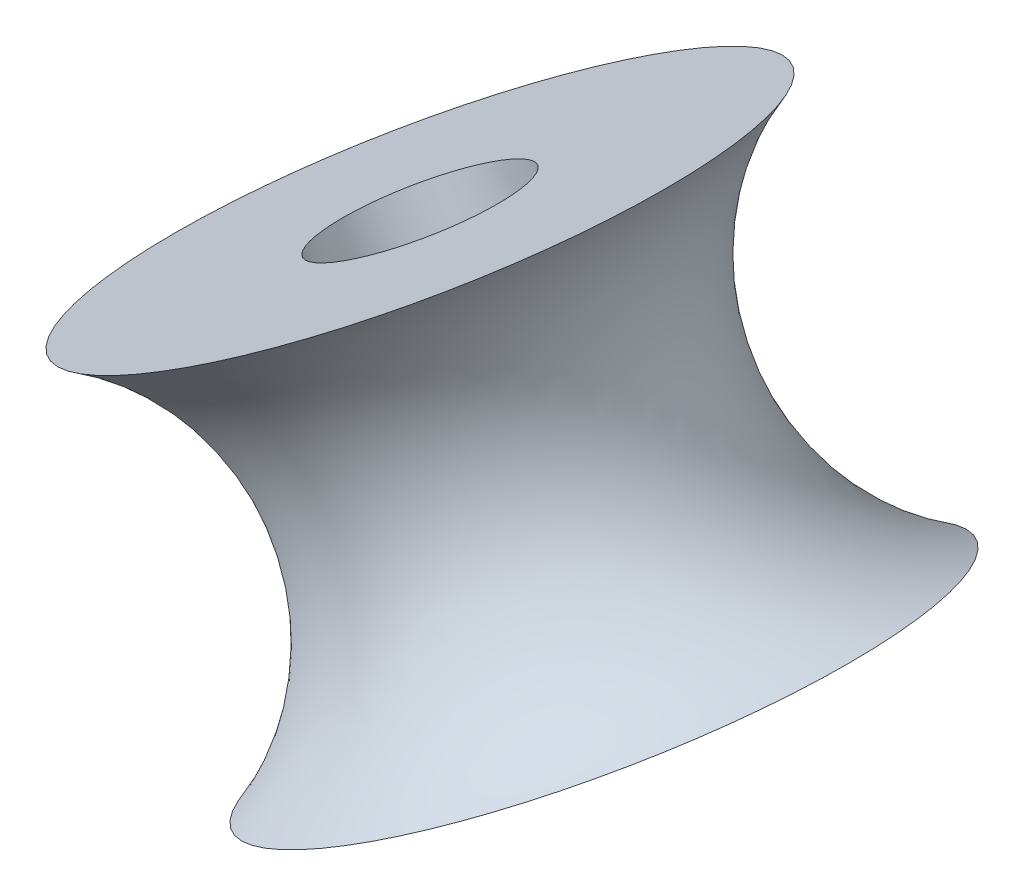
ISO-10303-21;
HEADER;
FILE_DESCRIPTION(('STEP AP214'),'2;1');
FILE_NAME('part.step','',(''),(''),'','','');
FILE_SCHEMA(('AUTOMOTIVE_DESIGN { 1 0 10303 214 1 1 1 1 }'));
ENDSEC;
DATA;
#1=APPLICATION_CONTEXT('core data for automotive mechanical design processes');
#2=APPLICATION_PROTOCOL_DEFINITION('international standard','automotive_design',2000,#1);
#3=PRODUCT_CONTEXT('',#1,'mechanical');
#4=PRODUCT('Part','Part','',(#3));
#5=PRODUCT_RELATED_PRODUCT_CATEGORY('part','',(#4));
#6=PRODUCT_DEFINITION_FORMATION('','',#4);
#7=PRODUCT_DEFINITION_CONTEXT('part definition',#1,'design');
#8=PRODUCT_DEFINITION('design','',#6,#7);
#9=PRODUCT_DEFINITION_SHAPE('','',#8);
#10=(LENGTH_UNIT() NAMED_UNIT(*) SI_UNIT(.MILLI.,.METRE.));
#11=(NAMED_UNIT(*) PLANE_ANGLE_UNIT() SI_UNIT($,.RADIAN.));
#12=(NAMED_UNIT(*) SI_UNIT($,.STERADIAN.) SOLID_ANGLE_UNIT());
#13=UNCERTAINTY_MEASURE_WITH_UNIT(LENGTH_MEASURE(1.E-05),#10,'distance_accuracy_value','');
#14=(GEOMETRIC_REPRESENTATION_CONTEXT(3) GLOBAL_UNCERTAINTY_ASSIGNED_CONTEXT((#13)) GLOBAL_UNIT_ASSIGNED_CONTEXT((#10,
#11,#12)) REPRESENTATION_CONTEXT('',''));
#15=CARTESIAN_POINT('',(0.,0.,0.));
#16=DIRECTION('',(0.,0.,1.));
#17=DIRECTION('',(1.,0.,0.));
#18=AXIS2_PLACEMENT_3D('',#15,#16,#17);
#19=CARTESIAN_POINT('',(-5.84601811404184E-13,5.82867087928207E-13,0.));
#20=DIRECTION('',(-0.5,0.866025403784439,0.));
#21=DIRECTION('',(-0.866025403784439,-0.5,0.));
#22=AXIS2_PLACEMENT_3D('',#19,#20,#21);
#23=TOROIDAL_SURFACE('',#22,11.6444415837057,6.35000000000081);
#24=CARTESIAN_POINT('',(-2.67500000000085,4.63323591024779,0.));
#25=DIRECTION('',(-0.5,0.866025403784439,0.));
#26=DIRECTION('',(-0.866025403784439,-0.5,0.));
#27=AXIS2_PLACEMENT_3D('',#24,#25,#26);
#28=CIRCLE('',#27,8.2239153084076);
#29=CARTESIAN_POINT('',(-9.79711957565357,0.521278256043992,0.));
#30=VERTEX_POINT('',#29);
#31=EDGE_CURVE('E10',#30,#30,#28,.T.);
#32=ORIENTED_EDGE('',*,*,#31,.F.);
#33=EDGE_LOOP('',(#32));
#34=FACE_BOUND('',#33,.T.);
#35=CARTESIAN_POINT('',(2.67499999999982,-4.63323591024687,0.));
#36=DIRECTION('',(-0.5,0.866025403784439,0.));
#37=DIRECTION('',(-0.866025403784439,-0.5,0.));
#38=AXIS2_PLACEMENT_3D('',#35,#36,#37);
#39=CIRCLE('',#38,8.22391530840803);
#40=CARTESIAN_POINT('',(-4.44711957565327,-8.74519356445088,0.));
#41=VERTEX_POINT('',#40);
#42=EDGE_CURVE('E53',#41,#41,#39,.T.);
#43=ORIENTED_EDGE('',*,*,#42,.T.);
#44=EDGE_LOOP('',(#43));
#45=FACE_BOUND('',#44,.T.);
#46=ADVANCED_FACE('F39',(#34,#45),#23,.F.);
#47=CARTESIAN_POINT('',(4.44711957565187,8.74519356445159,0.));
#48=DIRECTION('',(0.5,-0.866025403784439,0.));
#49=DIRECTION('',(0.866025403784439,0.5,0.));
#50=AXIS2_PLACEMENT_3D('',#47,#48,#49);
#51=PLANE('',#50);
#52=CARTESIAN_POINT('',(-2.67500000000085,4.63323591024779,0.));
#53=DIRECTION('',(-0.5,0.866025403784439,0.));
#54=DIRECTION('',(-0.866025403784439,-0.5,0.));
#55=AXIS2_PLACEMENT_3D('',#52,#53,#54);
#56=CIRCLE('',#55,2.60000000000024);
#57=CARTESIAN_POINT('',(-4.9266660498406,3.33323591024767,0.));
#58=VERTEX_POINT('',#57);
#59=EDGE_CURVE('E45',#58,#58,#56,.T.);
#60=ORIENTED_EDGE('',*,*,#59,.F.);
#61=EDGE_LOOP('',(#60));
#62=FACE_BOUND('',#61,.T.);
#63=ORIENTED_EDGE('',*,*,#31,.T.);
#64=EDGE_LOOP('',(#63));
#65=FACE_BOUND('',#64,.T.);
#66=ADVANCED_FACE('F68',(#62,#65),#51,.F.);
#67=CARTESIAN_POINT('',(-2.67500000000085,4.63323591024779,0.));
#68=DIRECTION('',(-0.5,0.866025403784439,0.));
#69=DIRECTION('',(-0.866025403784439,-0.5,0.));
#70=AXIS2_PLACEMENT_3D('',#67,#68,#69);
#71=CYLINDRICAL_SURFACE('',#70,2.60000000000024);
#72=CARTESIAN_POINT('',(2.67499999999982,-4.63323591024687,0.));
#73=DIRECTION('',(-0.5,0.866025403784439,0.));
#74=DIRECTION('',(-0.866025403784439,-0.5,0.));
#75=AXIS2_PLACEMENT_3D('',#72,#73,#74);
#76=CIRCLE('',#75,2.60000000000024);
#77=CARTESIAN_POINT('',(0.423333950160071,-5.93323591024699,0.));
#78=VERTEX_POINT('',#77);
#79=EDGE_CURVE('E49',#78,#78,#76,.T.);
#80=ORIENTED_EDGE('',*,*,#79,.F.);
#81=EDGE_LOOP('',(#80));
#82=FACE_BOUND('',#81,.T.);
#83=ORIENTED_EDGE('',*,*,#59,.T.);
#84=EDGE_LOOP('',(#83));
#85=FACE_BOUND('',#84,.T.);
#86=ADVANCED_FACE('F63',(#82,#85),#71,.F.);
#87=CARTESIAN_POINT('',(9.79711957565291,-0.521278256042852,0.));
#88=DIRECTION('',(-0.5,0.866025403784439,0.));
#89=DIRECTION('',(-0.866025403784439,-0.5,0.));
#90=AXIS2_PLACEMENT_3D('',#87,#88,#89);
#91=PLANE('',#90);
#92=ORIENTED_EDGE('',*,*,#42,.F.);
#93=EDGE_LOOP('',(#92));
#94=FACE_BOUND('',#93,.T.);
#95=ORIENTED_EDGE('',*,*,#79,.T.);
#96=EDGE_LOOP('',(#95));
#97=FACE_BOUND('',#96,.T.);
#98=ADVANCED_FACE('F60',(#94,#97),#91,.F.);
#99=CLOSED_SHELL('',(#46,#66,#86,#98));
#100=MANIFOLD_SOLID_BREP('B2',#99);
#101=ADVANCED_BREP_SHAPE_REPRESENTATION('',(#18,#100),#14);
#102=SHAPE_DEFINITION_REPRESENTATION(#9,#101);
ENDSEC;
END-ISO-10303-21;
